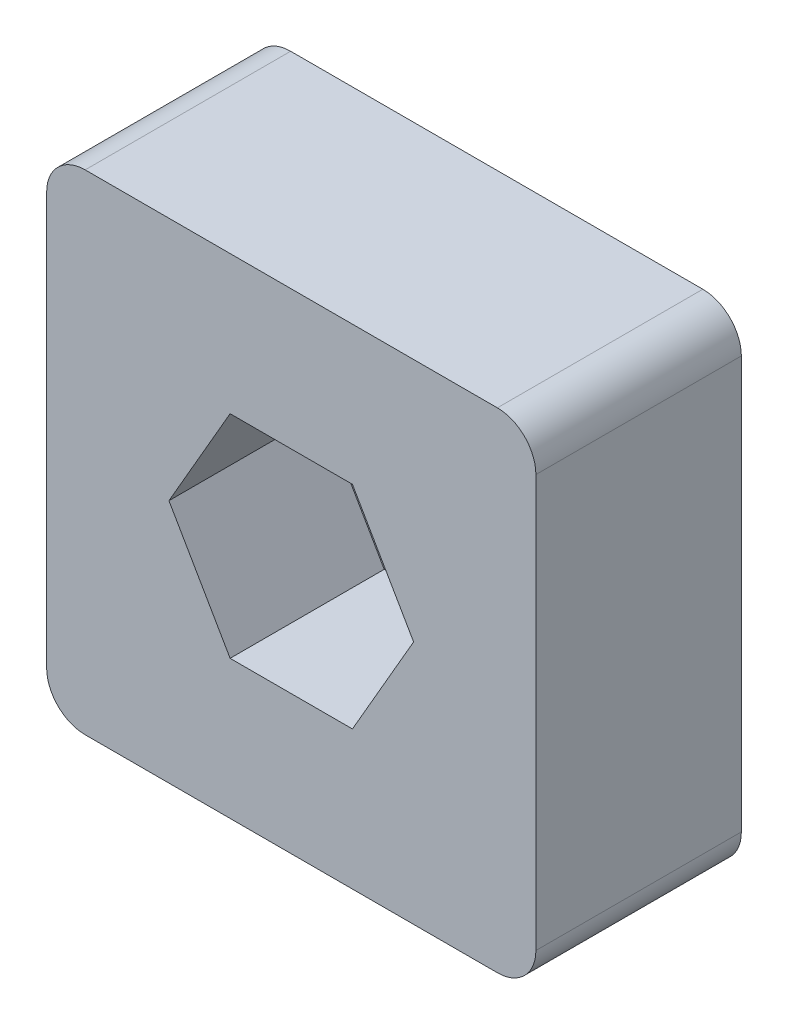
ISO-10303-21;
HEADER;
FILE_DESCRIPTION(('STEP AP214'),'2;1');
FILE_NAME('part.step','',(''),(''),'','','');
FILE_SCHEMA(('AUTOMOTIVE_DESIGN { 1 0 10303 214 1 1 1 1 }'));
ENDSEC;
DATA;
#1=APPLICATION_CONTEXT('core data for automotive mechanical design processes');
#2=APPLICATION_PROTOCOL_DEFINITION('international standard','automotive_design',2000,#1);
#3=PRODUCT_CONTEXT('',#1,'mechanical');
#4=PRODUCT('Part','Part','',(#3));
#5=PRODUCT_RELATED_PRODUCT_CATEGORY('part','',(#4));
#6=PRODUCT_DEFINITION_FORMATION('','',#4);
#7=PRODUCT_DEFINITION_CONTEXT('part definition',#1,'design');
#8=PRODUCT_DEFINITION('design','',#6,#7);
#9=PRODUCT_DEFINITION_SHAPE('','',#8);
#10=(LENGTH_UNIT() NAMED_UNIT(*) SI_UNIT(.MILLI.,.METRE.));
#11=(NAMED_UNIT(*) PLANE_ANGLE_UNIT() SI_UNIT($,.RADIAN.));
#12=(NAMED_UNIT(*) SI_UNIT($,.STERADIAN.) SOLID_ANGLE_UNIT());
#13=UNCERTAINTY_MEASURE_WITH_UNIT(LENGTH_MEASURE(1.E-05),#10,'distance_accuracy_value','');
#14=(GEOMETRIC_REPRESENTATION_CONTEXT(3) GLOBAL_UNCERTAINTY_ASSIGNED_CONTEXT((#13)) GLOBAL_UNIT_ASSIGNED_CONTEXT((#10,
#11,#12)) REPRESENTATION_CONTEXT('',''));
#15=CARTESIAN_POINT('',(0.,0.,0.));
#16=DIRECTION('',(0.,0.,1.));
#17=DIRECTION('',(1.,0.,0.));
#18=AXIS2_PLACEMENT_3D('',#15,#16,#17);
#19=CARTESIAN_POINT('',(0.,0.,8.));
#20=DIRECTION('',(1.,0.,0.));
#21=DIRECTION('',(0.,0.,-1.));
#22=AXIS2_PLACEMENT_3D('',#19,#20,#21);
#23=PLANE('',#22);
#24=DIRECTION('',(0.,-1.,0.));
#25=VECTOR('',#24,1.);
#26=CARTESIAN_POINT('',(0.,0.,0.));
#27=LINE('',#26,#25);
#28=CARTESIAN_POINT('',(0.,17.55,0.));
#29=VERTEX_POINT('',#28);
#30=CARTESIAN_POINT('',(0.,1.5,0.));
#31=VERTEX_POINT('',#30);
#32=EDGE_CURVE('E212',#29,#31,#27,.T.);
#33=ORIENTED_EDGE('',*,*,#32,.T.);
#34=DIRECTION('',(0.,0.,-1.));
#35=VECTOR('',#34,1.);
#36=CARTESIAN_POINT('',(0.,1.5,8.));
#37=LINE('',#36,#35);
#38=CARTESIAN_POINT('',(0.,1.5,8.));
#39=VERTEX_POINT('',#38);
#40=EDGE_CURVE('E287',#31,#39,#37,.F.);
#41=ORIENTED_EDGE('',*,*,#40,.T.);
#42=DIRECTION('',(0.,-1.,0.));
#43=VECTOR('',#42,1.);
#44=CARTESIAN_POINT('',(0.,0.,8.));
#45=LINE('',#44,#43);
#46=CARTESIAN_POINT('',(0.,17.55,8.));
#47=VERTEX_POINT('',#46);
#48=EDGE_CURVE('E213',#47,#39,#45,.T.);
#49=ORIENTED_EDGE('',*,*,#48,.F.);
#50=DIRECTION('',(0.,0.,-1.));
#51=VECTOR('',#50,1.);
#52=CARTESIAN_POINT('',(0.,17.55,8.));
#53=LINE('',#52,#51);
#54=EDGE_CURVE('E283',#47,#29,#53,.T.);
#55=ORIENTED_EDGE('',*,*,#54,.T.);
#56=EDGE_LOOP('',(#33,#41,#49,#55));
#57=FACE_BOUND('',#56,.T.);
#58=ADVANCED_FACE('F47',(#57),#23,.F.);
#59=CARTESIAN_POINT('',(0.,0.,8.));
#60=DIRECTION('',(0.,1.,0.));
#61=DIRECTION('',(0.,0.,1.));
#62=AXIS2_PLACEMENT_3D('',#59,#60,#61);
#63=PLANE('',#62);
#64=DIRECTION('',(1.,0.,0.));
#65=VECTOR('',#64,1.);
#66=CARTESIAN_POINT('',(0.,0.,0.));
#67=LINE('',#66,#65);
#68=CARTESIAN_POINT('',(1.5,0.,0.));
#69=VERTEX_POINT('',#68);
#70=CARTESIAN_POINT('',(17.55,0.,0.));
#71=VERTEX_POINT('',#70);
#72=EDGE_CURVE('E232',#69,#71,#67,.T.);
#73=ORIENTED_EDGE('',*,*,#72,.T.);
#74=DIRECTION('',(0.,0.,-1.));
#75=VECTOR('',#74,1.);
#76=CARTESIAN_POINT('',(17.55,0.,8.));
#77=LINE('',#76,#75);
#78=CARTESIAN_POINT('',(17.55,0.,8.));
#79=VERTEX_POINT('',#78);
#80=EDGE_CURVE('E269',#71,#79,#77,.F.);
#81=ORIENTED_EDGE('',*,*,#80,.T.);
#82=DIRECTION('',(1.,0.,0.));
#83=VECTOR('',#82,1.);
#84=CARTESIAN_POINT('',(0.,0.,8.));
#85=LINE('',#84,#83);
#86=CARTESIAN_POINT('',(1.5,0.,8.));
#87=VERTEX_POINT('',#86);
#88=EDGE_CURVE('E217',#87,#79,#85,.T.);
#89=ORIENTED_EDGE('',*,*,#88,.F.);
#90=DIRECTION('',(0.,0.,-1.));
#91=VECTOR('',#90,1.);
#92=CARTESIAN_POINT('',(1.5,0.,8.));
#93=LINE('',#92,#91);
#94=EDGE_CURVE('E265',#87,#69,#93,.T.);
#95=ORIENTED_EDGE('',*,*,#94,.T.);
#96=EDGE_LOOP('',(#73,#81,#89,#95));
#97=FACE_BOUND('',#96,.T.);
#98=ADVANCED_FACE('F304',(#97),#63,.F.);
#99=CARTESIAN_POINT('',(19.05,0.,8.));
#100=DIRECTION('',(-1.,0.,0.));
#101=DIRECTION('',(0.,0.,1.));
#102=AXIS2_PLACEMENT_3D('',#99,#100,#101);
#103=PLANE('',#102);
#104=DIRECTION('',(0.,1.,0.));
#105=VECTOR('',#104,1.);
#106=CARTESIAN_POINT('',(19.05,0.,8.));
#107=LINE('',#106,#105);
#108=CARTESIAN_POINT('',(19.05,1.5,8.));
#109=VERTEX_POINT('',#108);
#110=CARTESIAN_POINT('',(19.05,17.55,8.));
#111=VERTEX_POINT('',#110);
#112=EDGE_CURVE('E222',#109,#111,#107,.T.);
#113=ORIENTED_EDGE('',*,*,#112,.F.);
#114=DIRECTION('',(0.,0.,-1.));
#115=VECTOR('',#114,1.);
#116=CARTESIAN_POINT('',(19.05,1.5,8.));
#117=LINE('',#116,#115);
#118=CARTESIAN_POINT('',(19.05,1.5,0.));
#119=VERTEX_POINT('',#118);
#120=EDGE_CURVE('E249',#109,#119,#117,.T.);
#121=ORIENTED_EDGE('',*,*,#120,.T.);
#122=DIRECTION('',(0.,1.,0.));
#123=VECTOR('',#122,1.);
#124=CARTESIAN_POINT('',(19.05,0.,0.));
#125=LINE('',#124,#123);
#126=CARTESIAN_POINT('',(19.05,17.55,0.));
#127=VERTEX_POINT('',#126);
#128=EDGE_CURVE('E236',#119,#127,#125,.T.);
#129=ORIENTED_EDGE('',*,*,#128,.T.);
#130=DIRECTION('',(0.,0.,-1.));
#131=VECTOR('',#130,1.);
#132=CARTESIAN_POINT('',(19.05,17.55,8.));
#133=LINE('',#132,#131);
#134=EDGE_CURVE('E228',#127,#111,#133,.F.);
#135=ORIENTED_EDGE('',*,*,#134,.T.);
#136=EDGE_LOOP('',(#113,#121,#129,#135));
#137=FACE_BOUND('',#136,.T.);
#138=ADVANCED_FACE('F315',(#137),#103,.F.);
#139=CARTESIAN_POINT('',(0.,19.05,8.));
#140=DIRECTION('',(0.,-1.,0.));
#141=DIRECTION('',(0.,0.,-1.));
#142=AXIS2_PLACEMENT_3D('',#139,#140,#141);
#143=PLANE('',#142);
#144=DIRECTION('',(-1.,0.,0.));
#145=VECTOR('',#144,1.);
#146=CARTESIAN_POINT('',(0.,19.05,8.));
#147=LINE('',#146,#145);
#148=CARTESIAN_POINT('',(17.55,19.05,8.));
#149=VERTEX_POINT('',#148);
#150=CARTESIAN_POINT('',(1.5,19.05,8.));
#151=VERTEX_POINT('',#150);
#152=EDGE_CURVE('E225',#149,#151,#147,.T.);
#153=ORIENTED_EDGE('',*,*,#152,.F.);
#154=DIRECTION('',(0.,0.,-1.));
#155=VECTOR('',#154,1.);
#156=CARTESIAN_POINT('',(17.55,19.05,8.));
#157=LINE('',#156,#155);
#158=CARTESIAN_POINT('',(17.55,19.05,0.));
#159=VERTEX_POINT('',#158);
#160=EDGE_CURVE('E12',#149,#159,#157,.T.);
#161=ORIENTED_EDGE('',*,*,#160,.T.);
#162=DIRECTION('',(-1.,0.,0.));
#163=VECTOR('',#162,1.);
#164=CARTESIAN_POINT('',(0.,19.05,0.));
#165=LINE('',#164,#163);
#166=CARTESIAN_POINT('',(1.5,19.05,0.));
#167=VERTEX_POINT('',#166);
#168=EDGE_CURVE('E218',#159,#167,#165,.T.);
#169=ORIENTED_EDGE('',*,*,#168,.T.);
#170=DIRECTION('',(0.,0.,-1.));
#171=VECTOR('',#170,1.);
#172=CARTESIAN_POINT('',(1.5,19.05,8.));
#173=LINE('',#172,#171);
#174=EDGE_CURVE('E56',#167,#151,#173,.F.);
#175=ORIENTED_EDGE('',*,*,#174,.T.);
#176=EDGE_LOOP('',(#153,#161,#169,#175));
#177=FACE_BOUND('',#176,.T.);
#178=ADVANCED_FACE('F321',(#177),#143,.F.);
#179=CARTESIAN_POINT('',(0.,0.,8.));
#180=DIRECTION('',(0.,0.,-1.));
#181=DIRECTION('',(-1.,0.,0.));
#182=AXIS2_PLACEMENT_3D('',#179,#180,#181);
#183=PLANE('',#182);
#184=DIRECTION('',(-0.5,0.866025403784439,0.));
#185=VECTOR('',#184,1.);
#186=CARTESIAN_POINT('',(14.8405507804643,8.56819598802339,8.));
#187=LINE('',#186,#185);
#188=CARTESIAN_POINT('',(14.2881397265879,9.525,8.));
#189=VERTEX_POINT('',#188);
#190=CARTESIAN_POINT('',(11.906569863294,13.650000005,8.));
#191=VERTEX_POINT('',#190);
#192=EDGE_CURVE('E471',#189,#191,#187,.T.);
#193=ORIENTED_EDGE('',*,*,#192,.F.);
#194=DIRECTION('',(0.5,0.866025403784439,0.));
#195=VECTOR('',#194,1.);
#196=CARTESIAN_POINT('',(6.59165880941755,-3.80569598802339,8.));
#197=LINE('',#196,#195);
#198=CARTESIAN_POINT('',(11.906569863294,5.399999995,8.));
#199=VERTEX_POINT('',#198);
#200=EDGE_CURVE('E167',#199,#189,#197,.T.);
#201=ORIENTED_EDGE('',*,*,#200,.F.);
#202=DIRECTION('',(1.,0.,0.));
#203=VECTOR('',#202,1.);
#204=CARTESIAN_POINT('',(0.,5.399999995,8.));
#205=LINE('',#204,#203);
#206=CARTESIAN_POINT('',(7.14343013670604,5.399999995,8.));
#207=VERTEX_POINT('',#206);
#208=EDGE_CURVE('E183',#207,#199,#205,.T.);
#209=ORIENTED_EDGE('',*,*,#208,.F.);
#210=DIRECTION('',(0.5,-0.866025403784439,0.));
#211=VECTOR('',#210,1.);
#212=CARTESIAN_POINT('',(7.69584119058246,4.44319598302339,8.));
#213=LINE('',#212,#211);
#214=CARTESIAN_POINT('',(4.76186027341209,9.52500000000001,8.));
#215=VERTEX_POINT('',#214);
#216=EDGE_CURVE('E176',#215,#207,#213,.T.);
#217=ORIENTED_EDGE('',*,*,#216,.F.);
#218=DIRECTION('',(-0.5,-0.866025403784439,0.));
#219=VECTOR('',#218,1.);
#220=CARTESIAN_POINT('',(-0.553050780464327,0.319304016976612,8.));
#221=LINE('',#220,#219);
#222=CARTESIAN_POINT('',(7.14343013670604,13.650000005,8.));
#223=VERTEX_POINT('',#222);
#224=EDGE_CURVE('E179',#223,#215,#221,.T.);
#225=ORIENTED_EDGE('',*,*,#224,.F.);
#226=DIRECTION('',(-1.,0.,0.));
#227=VECTOR('',#226,1.);
#228=CARTESIAN_POINT('',(0.,13.650000005,8.));
#229=LINE('',#228,#227);
#230=EDGE_CURVE('E475',#191,#223,#229,.T.);
#231=ORIENTED_EDGE('',*,*,#230,.F.);
#232=EDGE_LOOP('',(#193,#201,#209,#217,#225,#231));
#233=FACE_BOUND('',#232,.T.);
#234=ORIENTED_EDGE('',*,*,#88,.T.);
#235=CARTESIAN_POINT('',(17.55,1.5,8.));
#236=DIRECTION('',(0.,0.,-1.));
#237=DIRECTION('',(-1.,0.,0.));
#238=AXIS2_PLACEMENT_3D('',#235,#236,#237);
#239=CIRCLE('',#238,1.5);
#240=EDGE_CURVE('E280',#79,#109,#239,.F.);
#241=ORIENTED_EDGE('',*,*,#240,.T.);
#242=ORIENTED_EDGE('',*,*,#112,.T.);
#243=CARTESIAN_POINT('',(17.55,17.55,8.));
#244=DIRECTION('',(0.,0.,-1.));
#245=DIRECTION('',(-1.,0.,0.));
#246=AXIS2_PLACEMENT_3D('',#243,#244,#245);
#247=CIRCLE('',#246,1.5);
#248=EDGE_CURVE('E69',#111,#149,#247,.F.);
#249=ORIENTED_EDGE('',*,*,#248,.T.);
#250=ORIENTED_EDGE('',*,*,#152,.T.);
#251=CARTESIAN_POINT('',(1.5,17.55,8.));
#252=DIRECTION('',(0.,0.,-1.));
#253=DIRECTION('',(-1.,0.,0.));
#254=AXIS2_PLACEMENT_3D('',#251,#252,#253);
#255=CIRCLE('',#254,1.5);
#256=EDGE_CURVE('E272',#151,#47,#255,.F.);
#257=ORIENTED_EDGE('',*,*,#256,.T.);
#258=ORIENTED_EDGE('',*,*,#48,.T.);
#259=CARTESIAN_POINT('',(1.5,1.5,8.));
#260=DIRECTION('',(0.,0.,-1.));
#261=DIRECTION('',(-1.,0.,0.));
#262=AXIS2_PLACEMENT_3D('',#259,#260,#261);
#263=CIRCLE('',#262,1.5);
#264=EDGE_CURVE('E277',#39,#87,#263,.F.);
#265=ORIENTED_EDGE('',*,*,#264,.T.);
#266=EDGE_LOOP('',(#234,#241,#242,#249,#250,#257,#258,#265));
#267=FACE_BOUND('',#266,.T.);
#268=ADVANCED_FACE('F297',(#233,#267),#183,.F.);
#269=CARTESIAN_POINT('',(0.,0.,0.));
#270=DIRECTION('',(0.,0.,-1.));
#271=DIRECTION('',(-1.,0.,0.));
#272=AXIS2_PLACEMENT_3D('',#269,#270,#271);
#273=PLANE('',#272);
#274=CARTESIAN_POINT('',(9.525,9.525,0.));
#275=DIRECTION('',(0.,0.,1.));
#276=DIRECTION('',(1.,0.,0.));
#277=AXIS2_PLACEMENT_3D('',#274,#275,#276);
#278=CIRCLE('',#277,2.75);
#279=CARTESIAN_POINT('',(12.275,9.525,0.));
#280=VERTEX_POINT('',#279);
#281=EDGE_CURVE('E246',#280,#280,#278,.T.);
#282=ORIENTED_EDGE('',*,*,#281,.T.);
#283=EDGE_LOOP('',(#282));
#284=FACE_BOUND('',#283,.T.);
#285=ORIENTED_EDGE('',*,*,#128,.F.);
#286=CARTESIAN_POINT('',(17.55,1.5,0.));
#287=DIRECTION('',(0.,0.,-1.));
#288=DIRECTION('',(-1.,0.,0.));
#289=AXIS2_PLACEMENT_3D('',#286,#287,#288);
#290=CIRCLE('',#289,1.5);
#291=EDGE_CURVE('E262',#119,#71,#290,.T.);
#292=ORIENTED_EDGE('',*,*,#291,.T.);
#293=ORIENTED_EDGE('',*,*,#72,.F.);
#294=CARTESIAN_POINT('',(1.5,1.5,0.));
#295=DIRECTION('',(0.,0.,-1.));
#296=DIRECTION('',(-1.,0.,0.));
#297=AXIS2_PLACEMENT_3D('',#294,#295,#296);
#298=CIRCLE('',#297,1.5);
#299=EDGE_CURVE('E259',#69,#31,#298,.T.);
#300=ORIENTED_EDGE('',*,*,#299,.T.);
#301=ORIENTED_EDGE('',*,*,#32,.F.);
#302=CARTESIAN_POINT('',(1.5,17.55,0.));
#303=DIRECTION('',(0.,0.,-1.));
#304=DIRECTION('',(-1.,0.,0.));
#305=AXIS2_PLACEMENT_3D('',#302,#303,#304);
#306=CIRCLE('',#305,1.5);
#307=EDGE_CURVE('E253',#29,#167,#306,.T.);
#308=ORIENTED_EDGE('',*,*,#307,.T.);
#309=ORIENTED_EDGE('',*,*,#168,.F.);
#310=CARTESIAN_POINT('',(17.55,17.55,0.));
#311=DIRECTION('',(0.,0.,-1.));
#312=DIRECTION('',(-1.,0.,0.));
#313=AXIS2_PLACEMENT_3D('',#310,#311,#312);
#314=CIRCLE('',#313,1.5);
#315=EDGE_CURVE('E256',#159,#127,#314,.T.);
#316=ORIENTED_EDGE('',*,*,#315,.T.);
#317=EDGE_LOOP('',(#285,#292,#293,#300,#301,#308,#309,#316));
#318=FACE_BOUND('',#317,.T.);
#319=ADVANCED_FACE('F308',(#284,#318),#273,.T.);
#320=CARTESIAN_POINT('',(0.,0.,2.));
#321=DIRECTION('',(0.,0.,-1.));
#322=DIRECTION('',(-1.,0.,0.));
#323=AXIS2_PLACEMENT_3D('',#320,#321,#322);
#324=PLANE('',#323);
#325=CARTESIAN_POINT('',(9.525,9.525,2.));
#326=DIRECTION('',(0.,0.,-1.));
#327=DIRECTION('',(-1.,0.,0.));
#328=AXIS2_PLACEMENT_3D('',#325,#326,#327);
#329=CIRCLE('',#328,2.75);
#330=CARTESIAN_POINT('',(6.775,9.525,2.));
#331=VERTEX_POINT('',#330);
#332=EDGE_CURVE('E242',#331,#331,#329,.T.);
#333=ORIENTED_EDGE('',*,*,#332,.T.);
#334=EDGE_LOOP('',(#333));
#335=FACE_BOUND('',#334,.T.);
#336=DIRECTION('',(1.,0.,0.));
#337=VECTOR('',#336,1.);
#338=CARTESIAN_POINT('',(0.,5.399999995,2.));
#339=LINE('',#338,#337);
#340=CARTESIAN_POINT('',(7.14343013670604,5.399999995,2.));
#341=VERTEX_POINT('',#340);
#342=CARTESIAN_POINT('',(11.906569863294,5.399999995,2.));
#343=VERTEX_POINT('',#342);
#344=EDGE_CURVE('E173',#341,#343,#339,.T.);
#345=ORIENTED_EDGE('',*,*,#344,.T.);
#346=DIRECTION('',(0.5,0.866025403784439,0.));
#347=VECTOR('',#346,1.);
#348=CARTESIAN_POINT('',(6.59165880941755,-3.80569598802339,2.));
#349=LINE('',#348,#347);
#350=CARTESIAN_POINT('',(14.2881397265879,9.525,2.));
#351=VERTEX_POINT('',#350);
#352=EDGE_CURVE('E164',#343,#351,#349,.T.);
#353=ORIENTED_EDGE('',*,*,#352,.T.);
#354=DIRECTION('',(-0.5,0.866025403784439,0.));
#355=VECTOR('',#354,1.);
#356=CARTESIAN_POINT('',(14.8405507804643,8.56819598802339,2.));
#357=LINE('',#356,#355);
#358=CARTESIAN_POINT('',(11.906569863294,13.650000005,2.));
#359=VERTEX_POINT('',#358);
#360=EDGE_CURVE('E150',#351,#359,#357,.T.);
#361=ORIENTED_EDGE('',*,*,#360,.T.);
#362=DIRECTION('',(-1.,0.,0.));
#363=VECTOR('',#362,1.);
#364=CARTESIAN_POINT('',(0.,13.650000005,2.));
#365=LINE('',#364,#363);
#366=CARTESIAN_POINT('',(7.14343013670604,13.650000005,2.));
#367=VERTEX_POINT('',#366);
#368=EDGE_CURVE('E198',#359,#367,#365,.T.);
#369=ORIENTED_EDGE('',*,*,#368,.T.);
#370=DIRECTION('',(-0.5,-0.866025403784439,0.));
#371=VECTOR('',#370,1.);
#372=CARTESIAN_POINT('',(-0.553050780464327,0.319304016976612,2.));
#373=LINE('',#372,#371);
#374=CARTESIAN_POINT('',(4.76186027341209,9.52500000000001,2.));
#375=VERTEX_POINT('',#374);
#376=EDGE_CURVE('E193',#367,#375,#373,.T.);
#377=ORIENTED_EDGE('',*,*,#376,.T.);
#378=DIRECTION('',(0.5,-0.866025403784439,0.));
#379=VECTOR('',#378,1.);
#380=CARTESIAN_POINT('',(7.69584119058246,4.44319598302339,2.));
#381=LINE('',#380,#379);
#382=EDGE_CURVE('E189',#375,#341,#381,.T.);
#383=ORIENTED_EDGE('',*,*,#382,.T.);
#384=EDGE_LOOP('',(#345,#353,#361,#369,#377,#383));
#385=FACE_BOUND('',#384,.T.);
#386=ADVANCED_FACE('F171',(#335,#385),#324,.F.);
#387=CARTESIAN_POINT('',(6.59165880941755,-3.80569598802339,-12.6020831764038));
#388=DIRECTION('',(0.866025403784439,-0.5,0.));
#389=DIRECTION('',(0.5,0.866025403784439,0.));
#390=AXIS2_PLACEMENT_3D('',#387,#388,#389);
#391=PLANE('',#390);
#392=DIRECTION('',(0.,0.,1.));
#393=VECTOR('',#392,1.);
#394=CARTESIAN_POINT('',(11.906569863294,5.399999995,-12.6020831764038));
#395=LINE('',#394,#393);
#396=EDGE_CURVE('E187',#343,#199,#395,.T.);
#397=ORIENTED_EDGE('',*,*,#396,.T.);
#398=ORIENTED_EDGE('',*,*,#200,.T.);
#399=DIRECTION('',(0.,0.,1.));
#400=VECTOR('',#399,1.);
#401=CARTESIAN_POINT('',(14.2881397265879,9.525,-12.6020831764038));
#402=LINE('',#401,#400);
#403=EDGE_CURVE('E154',#351,#189,#402,.T.);
#404=ORIENTED_EDGE('',*,*,#403,.F.);
#405=ORIENTED_EDGE('',*,*,#352,.F.);
#406=EDGE_LOOP('',(#397,#398,#404,#405));
#407=FACE_BOUND('',#406,.T.);
#408=ADVANCED_FACE('F163',(#407),#391,.F.);
#409=CARTESIAN_POINT('',(14.8405507804643,8.56819598802339,-12.6020831764038));
#410=DIRECTION('',(0.866025403784439,0.5,0.));
#411=DIRECTION('',(-0.5,0.866025403784439,0.));
#412=AXIS2_PLACEMENT_3D('',#409,#410,#411);
#413=PLANE('',#412);
#414=ORIENTED_EDGE('',*,*,#403,.T.);
#415=ORIENTED_EDGE('',*,*,#192,.T.);
#416=DIRECTION('',(0.,0.,1.));
#417=VECTOR('',#416,1.);
#418=CARTESIAN_POINT('',(11.906569863294,13.650000005,-12.6020831764038));
#419=LINE('',#418,#417);
#420=EDGE_CURVE('E156',#359,#191,#419,.T.);
#421=ORIENTED_EDGE('',*,*,#420,.F.);
#422=ORIENTED_EDGE('',*,*,#360,.F.);
#423=EDGE_LOOP('',(#414,#415,#421,#422));
#424=FACE_BOUND('',#423,.T.);
#425=ADVANCED_FACE('F152',(#424),#413,.F.);
#426=CARTESIAN_POINT('',(0.,13.650000005,-12.6020831764038));
#427=DIRECTION('',(0.,1.,0.));
#428=DIRECTION('',(0.,0.,1.));
#429=AXIS2_PLACEMENT_3D('',#426,#427,#428);
#430=PLANE('',#429);
#431=ORIENTED_EDGE('',*,*,#420,.T.);
#432=ORIENTED_EDGE('',*,*,#230,.T.);
#433=DIRECTION('',(0.,0.,1.));
#434=VECTOR('',#433,1.);
#435=CARTESIAN_POINT('',(7.14343013670604,13.650000005,-12.6020831764038));
#436=LINE('',#435,#434);
#437=EDGE_CURVE('E197',#367,#223,#436,.T.);
#438=ORIENTED_EDGE('',*,*,#437,.F.);
#439=ORIENTED_EDGE('',*,*,#368,.F.);
#440=EDGE_LOOP('',(#431,#432,#438,#439));
#441=FACE_BOUND('',#440,.T.);
#442=ADVANCED_FACE('F394',(#441),#430,.F.);
#443=CARTESIAN_POINT('',(-0.553050780464327,0.319304016976612,-12.6020831764038));
#444=DIRECTION('',(-0.866025403784438,0.5,0.));
#445=DIRECTION('',(-0.5,-0.866025403784439,0.));
#446=AXIS2_PLACEMENT_3D('',#443,#444,#445);
#447=PLANE('',#446);
#448=ORIENTED_EDGE('',*,*,#437,.T.);
#449=ORIENTED_EDGE('',*,*,#224,.T.);
#450=DIRECTION('',(0.,0.,1.));
#451=VECTOR('',#450,1.);
#452=CARTESIAN_POINT('',(4.76186027341209,9.52500000000001,-12.6020831764038));
#453=LINE('',#452,#451);
#454=EDGE_CURVE('E192',#375,#215,#453,.T.);
#455=ORIENTED_EDGE('',*,*,#454,.F.);
#456=ORIENTED_EDGE('',*,*,#376,.F.);
#457=EDGE_LOOP('',(#448,#449,#455,#456));
#458=FACE_BOUND('',#457,.T.);
#459=ADVANCED_FACE('F385',(#458),#447,.F.);
#460=CARTESIAN_POINT('',(7.69584119058246,4.44319598302339,-12.6020831764038));
#461=DIRECTION('',(-0.866025403784439,-0.5,0.));
#462=DIRECTION('',(0.5,-0.866025403784439,0.));
#463=AXIS2_PLACEMENT_3D('',#460,#461,#462);
#464=PLANE('',#463);
#465=ORIENTED_EDGE('',*,*,#454,.T.);
#466=ORIENTED_EDGE('',*,*,#216,.T.);
#467=DIRECTION('',(0.,0.,1.));
#468=VECTOR('',#467,1.);
#469=CARTESIAN_POINT('',(7.14343013670604,5.399999995,-12.6020831764038));
#470=LINE('',#469,#468);
#471=EDGE_CURVE('E188',#341,#207,#470,.T.);
#472=ORIENTED_EDGE('',*,*,#471,.F.);
#473=ORIENTED_EDGE('',*,*,#382,.F.);
#474=EDGE_LOOP('',(#465,#466,#472,#473));
#475=FACE_BOUND('',#474,.T.);
#476=ADVANCED_FACE('F376',(#475),#464,.F.);
#477=CARTESIAN_POINT('',(0.,5.399999995,-12.6020831764038));
#478=DIRECTION('',(0.,-1.,0.));
#479=DIRECTION('',(1.,0.,0.));
#480=AXIS2_PLACEMENT_3D('',#477,#478,#479);
#481=PLANE('',#480);
#482=ORIENTED_EDGE('',*,*,#471,.T.);
#483=ORIENTED_EDGE('',*,*,#208,.T.);
#484=ORIENTED_EDGE('',*,*,#396,.F.);
#485=ORIENTED_EDGE('',*,*,#344,.F.);
#486=EDGE_LOOP('',(#482,#483,#484,#485));
#487=FACE_BOUND('',#486,.T.);
#488=ADVANCED_FACE('F367',(#487),#481,.F.);
#489=CARTESIAN_POINT('',(9.525,9.525,0.));
#490=DIRECTION('',(0.,0.,1.));
#491=DIRECTION('',(1.,0.,0.));
#492=AXIS2_PLACEMENT_3D('',#489,#490,#491);
#493=CYLINDRICAL_SURFACE('',#492,2.75);
#494=ORIENTED_EDGE('',*,*,#281,.F.);
#495=EDGE_LOOP('',(#494));
#496=FACE_BOUND('',#495,.T.);
#497=ORIENTED_EDGE('',*,*,#332,.F.);
#498=EDGE_LOOP('',(#497));
#499=FACE_BOUND('',#498,.T.);
#500=ADVANCED_FACE('F338',(#496,#499),#493,.F.);
#501=CARTESIAN_POINT('',(17.55,1.5,8.));
#502=DIRECTION('',(0.,0.,-1.));
#503=DIRECTION('',(-1.,0.,0.));
#504=AXIS2_PLACEMENT_3D('',#501,#502,#503);
#505=CYLINDRICAL_SURFACE('',#504,1.5);
#506=ORIENTED_EDGE('',*,*,#240,.F.);
#507=ORIENTED_EDGE('',*,*,#80,.F.);
#508=ORIENTED_EDGE('',*,*,#291,.F.);
#509=ORIENTED_EDGE('',*,*,#120,.F.);
#510=EDGE_LOOP('',(#506,#507,#508,#509));
#511=FACE_BOUND('',#510,.T.);
#512=ADVANCED_FACE('F312',(#511),#505,.T.);
#513=CARTESIAN_POINT('',(1.5,1.5,8.));
#514=DIRECTION('',(0.,0.,-1.));
#515=DIRECTION('',(-1.,0.,0.));
#516=AXIS2_PLACEMENT_3D('',#513,#514,#515);
#517=CYLINDRICAL_SURFACE('',#516,1.5);
#518=ORIENTED_EDGE('',*,*,#264,.F.);
#519=ORIENTED_EDGE('',*,*,#40,.F.);
#520=ORIENTED_EDGE('',*,*,#299,.F.);
#521=ORIENTED_EDGE('',*,*,#94,.F.);
#522=EDGE_LOOP('',(#518,#519,#520,#521));
#523=FACE_BOUND('',#522,.T.);
#524=ADVANCED_FACE('F301',(#523),#517,.T.);
#525=CARTESIAN_POINT('',(17.55,17.55,8.));
#526=DIRECTION('',(0.,0.,-1.));
#527=DIRECTION('',(-1.,0.,0.));
#528=AXIS2_PLACEMENT_3D('',#525,#526,#527);
#529=CYLINDRICAL_SURFACE('',#528,1.5);
#530=ORIENTED_EDGE('',*,*,#248,.F.);
#531=ORIENTED_EDGE('',*,*,#134,.F.);
#532=ORIENTED_EDGE('',*,*,#315,.F.);
#533=ORIENTED_EDGE('',*,*,#160,.F.);
#534=EDGE_LOOP('',(#530,#531,#532,#533));
#535=FACE_BOUND('',#534,.T.);
#536=ADVANCED_FACE('F319',(#535),#529,.T.);
#537=CARTESIAN_POINT('',(1.5,17.55,8.));
#538=DIRECTION('',(0.,0.,-1.));
#539=DIRECTION('',(-1.,0.,0.));
#540=AXIS2_PLACEMENT_3D('',#537,#538,#539);
#541=CYLINDRICAL_SURFACE('',#540,1.5);
#542=ORIENTED_EDGE('',*,*,#256,.F.);
#543=ORIENTED_EDGE('',*,*,#174,.F.);
#544=ORIENTED_EDGE('',*,*,#307,.F.);
#545=ORIENTED_EDGE('',*,*,#54,.F.);
#546=EDGE_LOOP('',(#542,#543,#544,#545));
#547=FACE_BOUND('',#546,.T.);
#548=ADVANCED_FACE('F49',(#547),#541,.T.);
#549=CLOSED_SHELL('',(#58,#98,#138,#178,#268,#319,#386,#408,#425,#442,#459,#476,#488,#500,#512,
#524,#536,#548));
#550=MANIFOLD_SOLID_BREP('B2',#549);
#551=ADVANCED_BREP_SHAPE_REPRESENTATION('',(#18,#550),#14);
#552=SHAPE_DEFINITION_REPRESENTATION(#9,#551);
ENDSEC;
END-ISO-10303-21;
